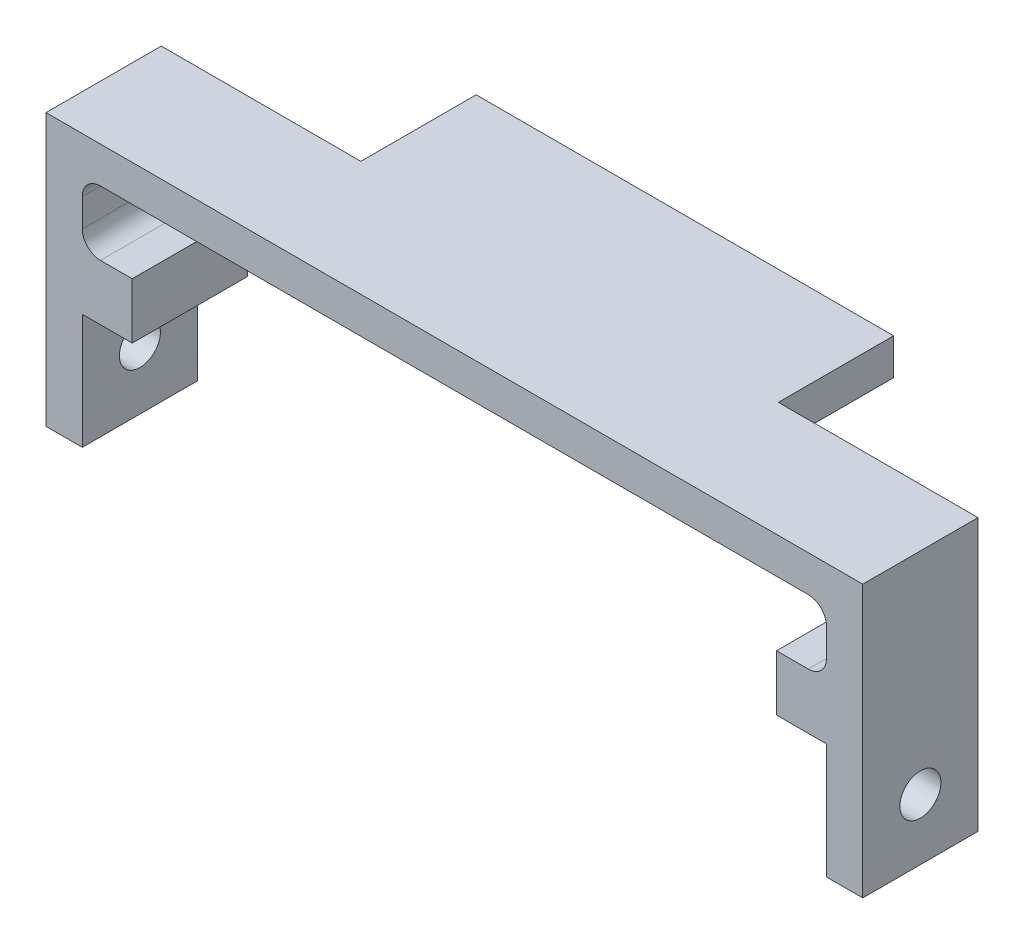
ISO-10303-21;
HEADER;
FILE_DESCRIPTION(('STEP AP214'),'2;1');
FILE_NAME('part.step','',(''),(''),'','','');
FILE_SCHEMA(('AUTOMOTIVE_DESIGN { 1 0 10303 214 1 1 1 1 }'));
ENDSEC;
DATA;
#1=APPLICATION_CONTEXT('core data for automotive mechanical design processes');
#2=APPLICATION_PROTOCOL_DEFINITION('international standard','automotive_design',2000,#1);
#3=PRODUCT_CONTEXT('',#1,'mechanical');
#4=PRODUCT('Part','Part','',(#3));
#5=PRODUCT_RELATED_PRODUCT_CATEGORY('part','',(#4));
#6=PRODUCT_DEFINITION_FORMATION('','',#4);
#7=PRODUCT_DEFINITION_CONTEXT('part definition',#1,'design');
#8=PRODUCT_DEFINITION('design','',#6,#7);
#9=PRODUCT_DEFINITION_SHAPE('','',#8);
#10=(LENGTH_UNIT() NAMED_UNIT(*) SI_UNIT(.MILLI.,.METRE.));
#11=(NAMED_UNIT(*) PLANE_ANGLE_UNIT() SI_UNIT($,.RADIAN.));
#12=(NAMED_UNIT(*) SI_UNIT($,.STERADIAN.) SOLID_ANGLE_UNIT());
#13=UNCERTAINTY_MEASURE_WITH_UNIT(LENGTH_MEASURE(1.E-05),#10,'distance_accuracy_value','');
#14=(GEOMETRIC_REPRESENTATION_CONTEXT(3) GLOBAL_UNCERTAINTY_ASSIGNED_CONTEXT((#13)) GLOBAL_UNIT_ASSIGNED_CONTEXT((#10,
#11,#12)) REPRESENTATION_CONTEXT('',''));
#15=CARTESIAN_POINT('',(0.,0.,0.));
#16=DIRECTION('',(0.,0.,1.));
#17=DIRECTION('',(1.,0.,0.));
#18=AXIS2_PLACEMENT_3D('',#15,#16,#17);
#19=CARTESIAN_POINT('',(0.,0.,0.));
#20=DIRECTION('',(0.,0.,1.));
#21=DIRECTION('',(1.,0.,0.));
#22=AXIS2_PLACEMENT_3D('',#19,#20,#21);
#23=PLANE('',#22);
#24=DIRECTION('',(0.,1.,0.));
#25=VECTOR('',#24,1.);
#26=CARTESIAN_POINT('',(8.,-23.3604798778231,0.));
#27=LINE('',#26,#25);
#28=CARTESIAN_POINT('',(8.,0.499999999999994,0.));
#29=VERTEX_POINT('',#28);
#30=CARTESIAN_POINT('',(8.,2.5,0.));
#31=VERTEX_POINT('',#30);
#32=EDGE_CURVE('E215',#29,#31,#27,.T.);
#33=ORIENTED_EDGE('',*,*,#32,.F.);
#34=DIRECTION('',(1.,0.,0.));
#35=VECTOR('',#34,1.);
#36=CARTESIAN_POINT('',(0.,0.5,0.));
#37=LINE('',#36,#35);
#38=CARTESIAN_POINT('',(0.,0.5,0.));
#39=VERTEX_POINT('',#38);
#40=EDGE_CURVE('E247',#39,#29,#37,.T.);
#41=ORIENTED_EDGE('',*,*,#40,.F.);
#42=CARTESIAN_POINT('',(0.,-0.5,0.));
#43=DIRECTION('',(0.,0.,1.));
#44=DIRECTION('',(1.,0.,0.));
#45=AXIS2_PLACEMENT_3D('',#42,#43,#44);
#46=CIRCLE('',#45,1.);
#47=CARTESIAN_POINT('',(-1.,-0.5,0.));
#48=VERTEX_POINT('',#47);
#49=EDGE_CURVE('E373',#39,#48,#46,.T.);
#50=ORIENTED_EDGE('',*,*,#49,.T.);
#51=DIRECTION('',(0.,1.,0.));
#52=VECTOR('',#51,1.);
#53=CARTESIAN_POINT('',(-1.,0.,0.));
#54=LINE('',#53,#52);
#55=CARTESIAN_POINT('',(-1.,-2.0525,0.));
#56=VERTEX_POINT('',#55);
#57=EDGE_CURVE('E303',#56,#48,#54,.T.);
#58=ORIENTED_EDGE('',*,*,#57,.F.);
#59=CARTESIAN_POINT('',(0.,-2.0525,0.));
#60=DIRECTION('',(0.,0.,1.));
#61=DIRECTION('',(1.,0.,0.));
#62=AXIS2_PLACEMENT_3D('',#59,#60,#61);
#63=CIRCLE('',#62,1.);
#64=CARTESIAN_POINT('',(0.,-3.0525,0.));
#65=VERTEX_POINT('',#64);
#66=EDGE_CURVE('E369',#56,#65,#63,.T.);
#67=ORIENTED_EDGE('',*,*,#66,.T.);
#68=DIRECTION('',(-1.,0.,0.));
#69=VECTOR('',#68,1.);
#70=CARTESIAN_POINT('',(0.,-3.0525,0.));
#71=LINE('',#70,#69);
#72=CARTESIAN_POINT('',(1.75,-3.0525,0.));
#73=VERTEX_POINT('',#72);
#74=EDGE_CURVE('E307',#73,#65,#71,.T.);
#75=ORIENTED_EDGE('',*,*,#74,.F.);
#76=DIRECTION('',(0.,1.,0.));
#77=VECTOR('',#76,1.);
#78=CARTESIAN_POINT('',(1.75,0.,0.));
#79=LINE('',#78,#77);
#80=CARTESIAN_POINT('',(1.75,-6.1225,0.));
#81=VERTEX_POINT('',#80);
#82=EDGE_CURVE('E305',#81,#73,#79,.T.);
#83=ORIENTED_EDGE('',*,*,#82,.F.);
#84=DIRECTION('',(1.,0.,0.));
#85=VECTOR('',#84,1.);
#86=CARTESIAN_POINT('',(0.,-6.1225,0.));
#87=LINE('',#86,#85);
#88=CARTESIAN_POINT('',(-1.,-6.1225,0.));
#89=VERTEX_POINT('',#88);
#90=EDGE_CURVE('E302',#89,#81,#87,.T.);
#91=ORIENTED_EDGE('',*,*,#90,.F.);
#92=CARTESIAN_POINT('',(-1.,-12.4725,0.));
#93=VERTEX_POINT('',#92);
#94=EDGE_CURVE('E300',#93,#89,#54,.T.);
#95=ORIENTED_EDGE('',*,*,#94,.F.);
#96=DIRECTION('',(1.,0.,0.));
#97=VECTOR('',#96,1.);
#98=CARTESIAN_POINT('',(0.,-12.4725,0.));
#99=LINE('',#98,#97);
#100=CARTESIAN_POINT('',(-3.,-12.4725,0.));
#101=VERTEX_POINT('',#100);
#102=EDGE_CURVE('E292',#101,#93,#99,.T.);
#103=ORIENTED_EDGE('',*,*,#102,.F.);
#104=DIRECTION('',(0.,-1.,0.));
#105=VECTOR('',#104,1.);
#106=CARTESIAN_POINT('',(-3.,0.,0.));
#107=LINE('',#106,#105);
#108=CARTESIAN_POINT('',(-3.,2.5,0.));
#109=VERTEX_POINT('',#108);
#110=EDGE_CURVE('E298',#109,#101,#107,.T.);
#111=ORIENTED_EDGE('',*,*,#110,.F.);
#112=DIRECTION('',(1.,0.,0.));
#113=VECTOR('',#112,1.);
#114=CARTESIAN_POINT('',(0.,2.5,0.));
#115=LINE('',#114,#113);
#116=EDGE_CURVE('E296',#109,#31,#115,.T.);
#117=ORIENTED_EDGE('',*,*,#116,.T.);
#118=EDGE_LOOP('',(#33,#41,#50,#58,#67,#75,#83,#91,#95,#103,#111,#117));
#119=FACE_BOUND('',#118,.T.);
#120=ADVANCED_FACE('F45',(#119),#23,.F.);
#121=CARTESIAN_POINT('',(40.,0.,6.35));
#122=DIRECTION('',(1.,0.,0.));
#123=DIRECTION('',(0.,0.,-1.));
#124=AXIS2_PLACEMENT_3D('',#121,#122,#123);
#125=PLANE('',#124);
#126=DIRECTION('',(0.,-1.,0.));
#127=VECTOR('',#126,1.);
#128=CARTESIAN_POINT('',(40.,0.,6.35));
#129=LINE('',#128,#127);
#130=CARTESIAN_POINT('',(40.,-0.5,6.35));
#131=VERTEX_POINT('',#130);
#132=CARTESIAN_POINT('',(40.,-2.0525,6.35));
#133=VERTEX_POINT('',#132);
#134=EDGE_CURVE('E244',#131,#133,#129,.T.);
#135=ORIENTED_EDGE('',*,*,#134,.F.);
#136=DIRECTION('',(0.,0.,-1.));
#137=VECTOR('',#136,1.);
#138=CARTESIAN_POINT('',(40.,-0.5,0.));
#139=LINE('',#138,#137);
#140=CARTESIAN_POINT('',(40.,-0.5,0.));
#141=VERTEX_POINT('',#140);
#142=EDGE_CURVE('E364',#131,#141,#139,.T.);
#143=ORIENTED_EDGE('',*,*,#142,.T.);
#144=DIRECTION('',(0.,-1.,0.));
#145=VECTOR('',#144,1.);
#146=CARTESIAN_POINT('',(40.,0.,0.));
#147=LINE('',#146,#145);
#148=CARTESIAN_POINT('',(40.,-2.0525,0.));
#149=VERTEX_POINT('',#148);
#150=EDGE_CURVE('E243',#141,#149,#147,.T.);
#151=ORIENTED_EDGE('',*,*,#150,.T.);
#152=DIRECTION('',(0.,0.,-1.));
#153=VECTOR('',#152,1.);
#154=CARTESIAN_POINT('',(40.,-2.0525,6.35));
#155=LINE('',#154,#153);
#156=EDGE_CURVE('E362',#149,#133,#155,.F.);
#157=ORIENTED_EDGE('',*,*,#156,.T.);
#158=EDGE_LOOP('',(#135,#143,#151,#157));
#159=FACE_BOUND('',#158,.T.);
#160=ADVANCED_FACE('F388',(#159),#125,.F.);
#161=CARTESIAN_POINT('',(0.,-3.0525,6.35));
#162=DIRECTION('',(0.,-1.,0.));
#163=DIRECTION('',(0.,0.,-1.));
#164=AXIS2_PLACEMENT_3D('',#161,#162,#163);
#165=PLANE('',#164);
#166=DIRECTION('',(-1.,0.,0.));
#167=VECTOR('',#166,1.);
#168=CARTESIAN_POINT('',(0.,-3.0525,6.35));
#169=LINE('',#168,#167);
#170=CARTESIAN_POINT('',(39.,-3.0525,6.35));
#171=VERTEX_POINT('',#170);
#172=CARTESIAN_POINT('',(37.25,-3.0525,6.35));
#173=VERTEX_POINT('',#172);
#174=EDGE_CURVE('E246',#171,#173,#169,.T.);
#175=ORIENTED_EDGE('',*,*,#174,.F.);
#176=DIRECTION('',(0.,0.,-1.));
#177=VECTOR('',#176,1.);
#178=CARTESIAN_POINT('',(39.,-3.0525,0.));
#179=LINE('',#178,#177);
#180=CARTESIAN_POINT('',(39.,-3.0525,0.));
#181=VERTEX_POINT('',#180);
#182=EDGE_CURVE('E367',#171,#181,#179,.T.);
#183=ORIENTED_EDGE('',*,*,#182,.T.);
#184=DIRECTION('',(-1.,0.,0.));
#185=VECTOR('',#184,1.);
#186=CARTESIAN_POINT('',(0.,-3.0525,0.));
#187=LINE('',#186,#185);
#188=CARTESIAN_POINT('',(37.25,-3.0525,0.));
#189=VERTEX_POINT('',#188);
#190=EDGE_CURVE('E281',#181,#189,#187,.T.);
#191=ORIENTED_EDGE('',*,*,#190,.T.);
#192=DIRECTION('',(0.,0.,-1.));
#193=VECTOR('',#192,1.);
#194=CARTESIAN_POINT('',(37.25,-3.0525,6.35));
#195=LINE('',#194,#193);
#196=EDGE_CURVE('E342',#173,#189,#195,.T.);
#197=ORIENTED_EDGE('',*,*,#196,.F.);
#198=EDGE_LOOP('',(#175,#183,#191,#197));
#199=FACE_BOUND('',#198,.T.);
#200=ADVANCED_FACE('F391',(#199),#165,.F.);
#201=CARTESIAN_POINT('',(37.25,0.,6.35));
#202=DIRECTION('',(1.,0.,0.));
#203=DIRECTION('',(0.,0.,-1.));
#204=AXIS2_PLACEMENT_3D('',#201,#202,#203);
#205=PLANE('',#204);
#206=DIRECTION('',(0.,-1.,0.));
#207=VECTOR('',#206,1.);
#208=CARTESIAN_POINT('',(37.25,0.,0.));
#209=LINE('',#208,#207);
#210=CARTESIAN_POINT('',(37.25,-6.1225,0.));
#211=VERTEX_POINT('',#210);
#212=EDGE_CURVE('E284',#189,#211,#209,.T.);
#213=ORIENTED_EDGE('',*,*,#212,.T.);
#214=DIRECTION('',(0.,0.,-1.));
#215=VECTOR('',#214,1.);
#216=CARTESIAN_POINT('',(37.25,-6.1225,6.35));
#217=LINE('',#216,#215);
#218=CARTESIAN_POINT('',(37.25,-6.1225,6.35));
#219=VERTEX_POINT('',#218);
#220=EDGE_CURVE('E339',#219,#211,#217,.T.);
#221=ORIENTED_EDGE('',*,*,#220,.F.);
#222=DIRECTION('',(0.,-1.,0.));
#223=VECTOR('',#222,1.);
#224=CARTESIAN_POINT('',(37.25,0.,6.35));
#225=LINE('',#224,#223);
#226=EDGE_CURVE('E250',#173,#219,#225,.T.);
#227=ORIENTED_EDGE('',*,*,#226,.F.);
#228=ORIENTED_EDGE('',*,*,#196,.T.);
#229=EDGE_LOOP('',(#213,#221,#227,#228));
#230=FACE_BOUND('',#229,.T.);
#231=ADVANCED_FACE('F399',(#230),#205,.F.);
#232=CARTESIAN_POINT('',(0.,-6.1225,6.35));
#233=DIRECTION('',(0.,1.,0.));
#234=DIRECTION('',(0.,0.,1.));
#235=AXIS2_PLACEMENT_3D('',#232,#233,#234);
#236=PLANE('',#235);
#237=DIRECTION('',(1.,0.,0.));
#238=VECTOR('',#237,1.);
#239=CARTESIAN_POINT('',(0.,-6.1225,0.));
#240=LINE('',#239,#238);
#241=CARTESIAN_POINT('',(40.,-6.1225,0.));
#242=VERTEX_POINT('',#241);
#243=EDGE_CURVE('E286',#211,#242,#240,.T.);
#244=ORIENTED_EDGE('',*,*,#243,.T.);
#245=DIRECTION('',(0.,0.,-1.));
#246=VECTOR('',#245,1.);
#247=CARTESIAN_POINT('',(40.,-6.1225,6.35));
#248=LINE('',#247,#246);
#249=CARTESIAN_POINT('',(40.,-6.1225,6.35));
#250=VERTEX_POINT('',#249);
#251=EDGE_CURVE('E336',#250,#242,#248,.T.);
#252=ORIENTED_EDGE('',*,*,#251,.F.);
#253=DIRECTION('',(1.,0.,0.));
#254=VECTOR('',#253,1.);
#255=CARTESIAN_POINT('',(0.,-6.1225,6.35));
#256=LINE('',#255,#254);
#257=EDGE_CURVE('E252',#219,#250,#256,.T.);
#258=ORIENTED_EDGE('',*,*,#257,.F.);
#259=ORIENTED_EDGE('',*,*,#220,.T.);
#260=EDGE_LOOP('',(#244,#252,#258,#259));
#261=FACE_BOUND('',#260,.T.);
#262=ADVANCED_FACE('F402',(#261),#236,.F.);
#263=CARTESIAN_POINT('',(40.,-9.1225,3.175));
#264=DIRECTION('',(1.,0.,0.));
#265=DIRECTION('',(0.,0.,-1.));
#266=AXIS2_PLACEMENT_3D('',#263,#264,#265);
#267=CIRCLE('',#266,1.13029999999999);
#268=CARTESIAN_POINT('',(40.,-9.1225,2.04470000000001));
#269=VERTEX_POINT('',#268);
#270=EDGE_CURVE('E226',#269,#269,#267,.T.);
#271=ORIENTED_EDGE('',*,*,#270,.T.);
#272=EDGE_LOOP('',(#271));
#273=FACE_BOUND('',#272,.T.);
#274=CARTESIAN_POINT('',(40.,-12.4725,0.));
#275=VERTEX_POINT('',#274);
#276=EDGE_CURVE('E282',#242,#275,#147,.T.);
#277=ORIENTED_EDGE('',*,*,#276,.T.);
#278=DIRECTION('',(0.,0.,-1.));
#279=VECTOR('',#278,1.);
#280=CARTESIAN_POINT('',(40.,-12.4725,6.35));
#281=LINE('',#280,#279);
#282=CARTESIAN_POINT('',(40.,-12.4725,6.35));
#283=VERTEX_POINT('',#282);
#284=EDGE_CURVE('E333',#283,#275,#281,.T.);
#285=ORIENTED_EDGE('',*,*,#284,.F.);
#286=EDGE_CURVE('E248',#250,#283,#129,.T.);
#287=ORIENTED_EDGE('',*,*,#286,.F.);
#288=ORIENTED_EDGE('',*,*,#251,.T.);
#289=EDGE_LOOP('',(#277,#285,#287,#288));
#290=FACE_BOUND('',#289,.T.);
#291=ADVANCED_FACE('F407',(#273,#290),#125,.F.);
#292=CARTESIAN_POINT('',(0.,-12.4725,6.35));
#293=DIRECTION('',(0.,1.,0.));
#294=DIRECTION('',(0.,0.,1.));
#295=AXIS2_PLACEMENT_3D('',#292,#293,#294);
#296=PLANE('',#295);
#297=CARTESIAN_POINT('',(42.,-12.4725,0.));
#298=VERTEX_POINT('',#297);
#299=EDGE_CURVE('E288',#275,#298,#99,.T.);
#300=ORIENTED_EDGE('',*,*,#299,.T.);
#301=DIRECTION('',(0.,0.,-1.));
#302=VECTOR('',#301,1.);
#303=CARTESIAN_POINT('',(42.,-12.4725,6.35));
#304=LINE('',#303,#302);
#305=CARTESIAN_POINT('',(42.,-12.4725,6.35));
#306=VERTEX_POINT('',#305);
#307=EDGE_CURVE('E331',#306,#298,#304,.T.);
#308=ORIENTED_EDGE('',*,*,#307,.F.);
#309=DIRECTION('',(1.,0.,0.));
#310=VECTOR('',#309,1.);
#311=CARTESIAN_POINT('',(0.,-12.4725,6.35));
#312=LINE('',#311,#310);
#313=EDGE_CURVE('E254',#283,#306,#312,.T.);
#314=ORIENTED_EDGE('',*,*,#313,.F.);
#315=ORIENTED_EDGE('',*,*,#284,.T.);
#316=EDGE_LOOP('',(#300,#308,#314,#315));
#317=FACE_BOUND('',#316,.T.);
#318=ADVANCED_FACE('F413',(#317),#296,.F.);
#319=CARTESIAN_POINT('',(42.,0.,6.35));
#320=DIRECTION('',(1.,0.,0.));
#321=DIRECTION('',(0.,0.,-1.));
#322=AXIS2_PLACEMENT_3D('',#319,#320,#321);
#323=PLANE('',#322);
#324=CARTESIAN_POINT('',(42.,-9.1225,3.175));
#325=DIRECTION('',(1.,0.,0.));
#326=DIRECTION('',(0.,0.,-1.));
#327=AXIS2_PLACEMENT_3D('',#324,#325,#326);
#328=CIRCLE('',#327,1.13029999999999);
#329=CARTESIAN_POINT('',(42.,-9.1225,2.04470000000001));
#330=VERTEX_POINT('',#329);
#331=EDGE_CURVE('E349',#330,#330,#328,.T.);
#332=ORIENTED_EDGE('',*,*,#331,.F.);
#333=EDGE_LOOP('',(#332));
#334=FACE_BOUND('',#333,.T.);
#335=DIRECTION('',(0.,-1.,0.));
#336=VECTOR('',#335,1.);
#337=CARTESIAN_POINT('',(42.,0.,0.));
#338=LINE('',#337,#336);
#339=CARTESIAN_POINT('',(42.,2.5,0.));
#340=VERTEX_POINT('',#339);
#341=EDGE_CURVE('E291',#340,#298,#338,.T.);
#342=ORIENTED_EDGE('',*,*,#341,.F.);
#343=DIRECTION('',(0.,0.,-1.));
#344=VECTOR('',#343,1.);
#345=CARTESIAN_POINT('',(42.,2.5,6.35));
#346=LINE('',#345,#344);
#347=CARTESIAN_POINT('',(42.,2.5,6.35));
#348=VERTEX_POINT('',#347);
#349=EDGE_CURVE('E328',#348,#340,#346,.T.);
#350=ORIENTED_EDGE('',*,*,#349,.F.);
#351=DIRECTION('',(0.,-1.,0.));
#352=VECTOR('',#351,1.);
#353=CARTESIAN_POINT('',(42.,0.,6.35));
#354=LINE('',#353,#352);
#355=EDGE_CURVE('E256',#348,#306,#354,.T.);
#356=ORIENTED_EDGE('',*,*,#355,.T.);
#357=ORIENTED_EDGE('',*,*,#307,.T.);
#358=EDGE_LOOP('',(#342,#350,#356,#357));
#359=FACE_BOUND('',#358,.T.);
#360=ADVANCED_FACE('F417',(#334,#359),#323,.T.);
#361=CARTESIAN_POINT('',(0.,2.5,6.35));
#362=DIRECTION('',(0.,1.,0.));
#363=DIRECTION('',(0.,0.,1.));
#364=AXIS2_PLACEMENT_3D('',#361,#362,#363);
#365=PLANE('',#364);
#366=ORIENTED_EDGE('',*,*,#116,.F.);
#367=DIRECTION('',(0.,0.,-1.));
#368=VECTOR('',#367,1.);
#369=CARTESIAN_POINT('',(-3.,2.5,6.35));
#370=LINE('',#369,#368);
#371=CARTESIAN_POINT('',(-3.,2.5,6.35));
#372=VERTEX_POINT('',#371);
#373=EDGE_CURVE('E326',#372,#109,#370,.T.);
#374=ORIENTED_EDGE('',*,*,#373,.F.);
#375=DIRECTION('',(1.,0.,0.));
#376=VECTOR('',#375,1.);
#377=CARTESIAN_POINT('',(0.,2.5,6.35));
#378=LINE('',#377,#376);
#379=EDGE_CURVE('E260',#372,#348,#378,.T.);
#380=ORIENTED_EDGE('',*,*,#379,.T.);
#381=ORIENTED_EDGE('',*,*,#349,.T.);
#382=CARTESIAN_POINT('',(31.,2.5,0.));
#383=VERTEX_POINT('',#382);
#384=EDGE_CURVE('E295',#383,#340,#115,.T.);
#385=ORIENTED_EDGE('',*,*,#384,.F.);
#386=DIRECTION('',(0.,0.,1.));
#387=VECTOR('',#386,1.);
#388=CARTESIAN_POINT('',(31.,2.5,0.));
#389=LINE('',#388,#387);
#390=CARTESIAN_POINT('',(31.,2.5,-6.35));
#391=VERTEX_POINT('',#390);
#392=EDGE_CURVE('E216',#391,#383,#389,.T.);
#393=ORIENTED_EDGE('',*,*,#392,.F.);
#394=DIRECTION('',(1.,0.,0.));
#395=VECTOR('',#394,1.);
#396=CARTESIAN_POINT('',(0.,2.5,-6.35));
#397=LINE('',#396,#395);
#398=CARTESIAN_POINT('',(8.,2.5,-6.35));
#399=VERTEX_POINT('',#398);
#400=EDGE_CURVE('E210',#399,#391,#397,.T.);
#401=ORIENTED_EDGE('',*,*,#400,.F.);
#402=DIRECTION('',(0.,0.,1.));
#403=VECTOR('',#402,1.);
#404=CARTESIAN_POINT('',(8.,2.5,0.));
#405=LINE('',#404,#403);
#406=EDGE_CURVE('E223',#399,#31,#405,.T.);
#407=ORIENTED_EDGE('',*,*,#406,.T.);
#408=EDGE_LOOP('',(#366,#374,#380,#381,#385,#393,#401,#407));
#409=FACE_BOUND('',#408,.T.);
#410=ADVANCED_FACE('F222',(#409),#365,.T.);
#411=CARTESIAN_POINT('',(-3.,0.,6.35));
#412=DIRECTION('',(1.,0.,0.));
#413=DIRECTION('',(0.,1.,0.));
#414=AXIS2_PLACEMENT_3D('',#411,#412,#413);
#415=PLANE('',#414);
#416=CARTESIAN_POINT('',(-3.,-9.1225,3.175));
#417=DIRECTION('',(-1.,0.,0.));
#418=DIRECTION('',(0.,0.,1.));
#419=AXIS2_PLACEMENT_3D('',#416,#417,#418);
#420=CIRCLE('',#419,1.13029999999999);
#421=CARTESIAN_POINT('',(-3.,-9.1225,4.30529999999999));
#422=VERTEX_POINT('',#421);
#423=EDGE_CURVE('E350',#422,#422,#420,.T.);
#424=ORIENTED_EDGE('',*,*,#423,.F.);
#425=EDGE_LOOP('',(#424));
#426=FACE_BOUND('',#425,.T.);
#427=ORIENTED_EDGE('',*,*,#110,.T.);
#428=DIRECTION('',(0.,0.,-1.));
#429=VECTOR('',#428,1.);
#430=CARTESIAN_POINT('',(-3.,-12.4725,6.35));
#431=LINE('',#430,#429);
#432=CARTESIAN_POINT('',(-3.,-12.4725,6.35));
#433=VERTEX_POINT('',#432);
#434=EDGE_CURVE('E323',#433,#101,#431,.T.);
#435=ORIENTED_EDGE('',*,*,#434,.F.);
#436=DIRECTION('',(0.,-1.,0.));
#437=VECTOR('',#436,1.);
#438=CARTESIAN_POINT('',(-3.,0.,6.35));
#439=LINE('',#438,#437);
#440=EDGE_CURVE('E263',#372,#433,#439,.T.);
#441=ORIENTED_EDGE('',*,*,#440,.F.);
#442=ORIENTED_EDGE('',*,*,#373,.T.);
#443=EDGE_LOOP('',(#427,#435,#441,#442));
#444=FACE_BOUND('',#443,.T.);
#445=ADVANCED_FACE('F423',(#426,#444),#415,.F.);
#446=ORIENTED_EDGE('',*,*,#102,.T.);
#447=DIRECTION('',(0.,0.,-1.));
#448=VECTOR('',#447,1.);
#449=CARTESIAN_POINT('',(-1.,-12.4725,6.35));
#450=LINE('',#449,#448);
#451=CARTESIAN_POINT('',(-1.,-12.4725,6.35));
#452=VERTEX_POINT('',#451);
#453=EDGE_CURVE('E320',#452,#93,#450,.T.);
#454=ORIENTED_EDGE('',*,*,#453,.F.);
#455=EDGE_CURVE('E257',#433,#452,#312,.T.);
#456=ORIENTED_EDGE('',*,*,#455,.F.);
#457=ORIENTED_EDGE('',*,*,#434,.T.);
#458=EDGE_LOOP('',(#446,#454,#456,#457));
#459=FACE_BOUND('',#458,.T.);
#460=ADVANCED_FACE('F427',(#459),#296,.F.);
#461=CARTESIAN_POINT('',(-1.,0.,6.35));
#462=DIRECTION('',(-1.,0.,0.));
#463=DIRECTION('',(0.,0.,1.));
#464=AXIS2_PLACEMENT_3D('',#461,#462,#463);
#465=PLANE('',#464);
#466=CARTESIAN_POINT('',(-1.,-9.1225,3.175));
#467=DIRECTION('',(-1.,0.,0.));
#468=DIRECTION('',(0.,0.,1.));
#469=AXIS2_PLACEMENT_3D('',#466,#467,#468);
#470=CIRCLE('',#469,1.13029999999999);
#471=CARTESIAN_POINT('',(-1.,-9.1225,4.30529999999999));
#472=VERTEX_POINT('',#471);
#473=EDGE_CURVE('E346',#472,#472,#470,.T.);
#474=ORIENTED_EDGE('',*,*,#473,.T.);
#475=EDGE_LOOP('',(#474));
#476=FACE_BOUND('',#475,.T.);
#477=ORIENTED_EDGE('',*,*,#94,.T.);
#478=DIRECTION('',(0.,0.,-1.));
#479=VECTOR('',#478,1.);
#480=CARTESIAN_POINT('',(-1.,-6.1225,6.35));
#481=LINE('',#480,#479);
#482=CARTESIAN_POINT('',(-1.,-6.1225,6.35));
#483=VERTEX_POINT('',#482);
#484=EDGE_CURVE('E317',#483,#89,#481,.T.);
#485=ORIENTED_EDGE('',*,*,#484,.F.);
#486=DIRECTION('',(0.,1.,0.));
#487=VECTOR('',#486,1.);
#488=CARTESIAN_POINT('',(-1.,0.,6.35));
#489=LINE('',#488,#487);
#490=EDGE_CURVE('E265',#452,#483,#489,.T.);
#491=ORIENTED_EDGE('',*,*,#490,.F.);
#492=ORIENTED_EDGE('',*,*,#453,.T.);
#493=EDGE_LOOP('',(#477,#485,#491,#492));
#494=FACE_BOUND('',#493,.T.);
#495=ADVANCED_FACE('F432',(#476,#494),#465,.F.);
#496=CARTESIAN_POINT('',(0.,-6.1225,6.35));
#497=DIRECTION('',(0.,1.,0.));
#498=DIRECTION('',(0.,0.,1.));
#499=AXIS2_PLACEMENT_3D('',#496,#497,#498);
#500=PLANE('',#499);
#501=ORIENTED_EDGE('',*,*,#90,.T.);
#502=DIRECTION('',(0.,0.,-1.));
#503=VECTOR('',#502,1.);
#504=CARTESIAN_POINT('',(1.75,-6.1225,6.35));
#505=LINE('',#504,#503);
#506=CARTESIAN_POINT('',(1.75,-6.1225,6.35));
#507=VERTEX_POINT('',#506);
#508=EDGE_CURVE('E314',#507,#81,#505,.T.);
#509=ORIENTED_EDGE('',*,*,#508,.F.);
#510=DIRECTION('',(1.,0.,0.));
#511=VECTOR('',#510,1.);
#512=CARTESIAN_POINT('',(0.,-6.1225,6.35));
#513=LINE('',#512,#511);
#514=EDGE_CURVE('E267',#483,#507,#513,.T.);
#515=ORIENTED_EDGE('',*,*,#514,.F.);
#516=ORIENTED_EDGE('',*,*,#484,.T.);
#517=EDGE_LOOP('',(#501,#509,#515,#516));
#518=FACE_BOUND('',#517,.T.);
#519=ADVANCED_FACE('F438',(#518),#500,.F.);
#520=CARTESIAN_POINT('',(1.75,0.,6.35));
#521=DIRECTION('',(-1.,0.,0.));
#522=DIRECTION('',(0.,0.,1.));
#523=AXIS2_PLACEMENT_3D('',#520,#521,#522);
#524=PLANE('',#523);
#525=ORIENTED_EDGE('',*,*,#82,.T.);
#526=DIRECTION('',(0.,0.,-1.));
#527=VECTOR('',#526,1.);
#528=CARTESIAN_POINT('',(1.75,-3.0525,6.35));
#529=LINE('',#528,#527);
#530=CARTESIAN_POINT('',(1.75,-3.0525,6.35));
#531=VERTEX_POINT('',#530);
#532=EDGE_CURVE('E278',#531,#73,#529,.T.);
#533=ORIENTED_EDGE('',*,*,#532,.F.);
#534=DIRECTION('',(0.,1.,0.));
#535=VECTOR('',#534,1.);
#536=CARTESIAN_POINT('',(1.75,0.,6.35));
#537=LINE('',#536,#535);
#538=EDGE_CURVE('E270',#507,#531,#537,.T.);
#539=ORIENTED_EDGE('',*,*,#538,.F.);
#540=ORIENTED_EDGE('',*,*,#508,.T.);
#541=EDGE_LOOP('',(#525,#533,#539,#540));
#542=FACE_BOUND('',#541,.T.);
#543=ADVANCED_FACE('F442',(#542),#524,.F.);
#544=CARTESIAN_POINT('',(0.,-3.0525,6.35));
#545=DIRECTION('',(0.,-1.,0.));
#546=DIRECTION('',(0.,0.,-1.));
#547=AXIS2_PLACEMENT_3D('',#544,#545,#546);
#548=PLANE('',#547);
#549=ORIENTED_EDGE('',*,*,#74,.T.);
#550=DIRECTION('',(0.,0.,-1.));
#551=VECTOR('',#550,1.);
#552=CARTESIAN_POINT('',(0.,-3.0525,6.35));
#553=LINE('',#552,#551);
#554=CARTESIAN_POINT('',(0.,-3.0525,6.35));
#555=VERTEX_POINT('',#554);
#556=EDGE_CURVE('E355',#65,#555,#553,.F.);
#557=ORIENTED_EDGE('',*,*,#556,.T.);
#558=DIRECTION('',(-1.,0.,0.));
#559=VECTOR('',#558,1.);
#560=CARTESIAN_POINT('',(0.,-3.0525,6.35));
#561=LINE('',#560,#559);
#562=EDGE_CURVE('E272',#531,#555,#561,.T.);
#563=ORIENTED_EDGE('',*,*,#562,.F.);
#564=ORIENTED_EDGE('',*,*,#532,.T.);
#565=EDGE_LOOP('',(#549,#557,#563,#564));
#566=FACE_BOUND('',#565,.T.);
#567=ADVANCED_FACE('F446',(#566),#548,.F.);
#568=CARTESIAN_POINT('',(-1.,-2.0525,6.35));
#569=VERTEX_POINT('',#568);
#570=CARTESIAN_POINT('',(-1.,-0.5,6.35));
#571=VERTEX_POINT('',#570);
#572=EDGE_CURVE('E268',#569,#571,#489,.T.);
#573=ORIENTED_EDGE('',*,*,#572,.F.);
#574=DIRECTION('',(0.,0.,-1.));
#575=VECTOR('',#574,1.);
#576=CARTESIAN_POINT('',(-1.,-2.0525,0.));
#577=LINE('',#576,#575);
#578=EDGE_CURVE('E352',#569,#56,#577,.T.);
#579=ORIENTED_EDGE('',*,*,#578,.T.);
#580=ORIENTED_EDGE('',*,*,#57,.T.);
#581=DIRECTION('',(0.,0.,-1.));
#582=VECTOR('',#581,1.);
#583=CARTESIAN_POINT('',(-1.,-0.5,6.35));
#584=LINE('',#583,#582);
#585=EDGE_CURVE('E345',#48,#571,#584,.F.);
#586=ORIENTED_EDGE('',*,*,#585,.T.);
#587=EDGE_LOOP('',(#573,#579,#580,#586));
#588=FACE_BOUND('',#587,.T.);
#589=ADVANCED_FACE('F457',(#588),#465,.F.);
#590=CARTESIAN_POINT('',(0.,0.5,6.35));
#591=DIRECTION('',(0.,1.,0.));
#592=DIRECTION('',(0.,0.,1.));
#593=AXIS2_PLACEMENT_3D('',#590,#591,#592);
#594=PLANE('',#593);
#595=DIRECTION('',(1.,0.,0.));
#596=VECTOR('',#595,1.);
#597=CARTESIAN_POINT('',(0.,0.5,6.35));
#598=LINE('',#597,#596);
#599=CARTESIAN_POINT('',(0.,0.5,6.35));
#600=VERTEX_POINT('',#599);
#601=CARTESIAN_POINT('',(39.,0.5,6.35));
#602=VERTEX_POINT('',#601);
#603=EDGE_CURVE('E275',#600,#602,#598,.T.);
#604=ORIENTED_EDGE('',*,*,#603,.F.);
#605=DIRECTION('',(0.,0.,-1.));
#606=VECTOR('',#605,1.);
#607=CARTESIAN_POINT('',(0.,0.5,0.));
#608=LINE('',#607,#606);
#609=EDGE_CURVE('E359',#600,#39,#608,.T.);
#610=ORIENTED_EDGE('',*,*,#609,.T.);
#611=ORIENTED_EDGE('',*,*,#40,.T.);
#612=DIRECTION('',(0.,0.,-1.));
#613=VECTOR('',#612,1.);
#614=CARTESIAN_POINT('',(8.,0.5,0.));
#615=LINE('',#614,#613);
#616=CARTESIAN_POINT('',(8.,0.5,-6.35));
#617=VERTEX_POINT('',#616);
#618=EDGE_CURVE('E241',#29,#617,#615,.T.);
#619=ORIENTED_EDGE('',*,*,#618,.T.);
#620=DIRECTION('',(-1.,0.,0.));
#621=VECTOR('',#620,1.);
#622=CARTESIAN_POINT('',(0.,0.5,-6.35));
#623=LINE('',#622,#621);
#624=CARTESIAN_POINT('',(31.,0.5,-6.35));
#625=VERTEX_POINT('',#624);
#626=EDGE_CURVE('E211',#625,#617,#623,.T.);
#627=ORIENTED_EDGE('',*,*,#626,.F.);
#628=DIRECTION('',(0.,0.,-1.));
#629=VECTOR('',#628,1.);
#630=CARTESIAN_POINT('',(31.,0.5,0.));
#631=LINE('',#630,#629);
#632=CARTESIAN_POINT('',(31.,0.5,0.));
#633=VERTEX_POINT('',#632);
#634=EDGE_CURVE('E236',#633,#625,#631,.T.);
#635=ORIENTED_EDGE('',*,*,#634,.F.);
#636=CARTESIAN_POINT('',(39.,0.5,0.));
#637=VERTEX_POINT('',#636);
#638=EDGE_CURVE('E311',#633,#637,#37,.T.);
#639=ORIENTED_EDGE('',*,*,#638,.T.);
#640=DIRECTION('',(0.,0.,-1.));
#641=VECTOR('',#640,1.);
#642=CARTESIAN_POINT('',(39.,0.5,6.35));
#643=LINE('',#642,#641);
#644=EDGE_CURVE('E357',#637,#602,#643,.F.);
#645=ORIENTED_EDGE('',*,*,#644,.T.);
#646=EDGE_LOOP('',(#604,#610,#611,#619,#627,#635,#639,#645));
#647=FACE_BOUND('',#646,.T.);
#648=ADVANCED_FACE('F465',(#647),#594,.F.);
#649=CARTESIAN_POINT('',(0.,0.,6.35));
#650=DIRECTION('',(0.,0.,1.));
#651=DIRECTION('',(1.,0.,0.));
#652=AXIS2_PLACEMENT_3D('',#649,#650,#651);
#653=PLANE('',#652);
#654=ORIENTED_EDGE('',*,*,#603,.T.);
#655=CARTESIAN_POINT('',(39.,-0.5,6.35));
#656=DIRECTION('',(0.,0.,1.));
#657=DIRECTION('',(1.,0.,0.));
#658=AXIS2_PLACEMENT_3D('',#655,#656,#657);
#659=CIRCLE('',#658,1.);
#660=EDGE_CURVE('E379',#602,#131,#659,.F.);
#661=ORIENTED_EDGE('',*,*,#660,.T.);
#662=ORIENTED_EDGE('',*,*,#134,.T.);
#663=CARTESIAN_POINT('',(39.,-2.0525,6.35));
#664=DIRECTION('',(0.,0.,1.));
#665=DIRECTION('',(1.,0.,0.));
#666=AXIS2_PLACEMENT_3D('',#663,#664,#665);
#667=CIRCLE('',#666,1.);
#668=EDGE_CURVE('E11',#133,#171,#667,.F.);
#669=ORIENTED_EDGE('',*,*,#668,.T.);
#670=ORIENTED_EDGE('',*,*,#174,.T.);
#671=ORIENTED_EDGE('',*,*,#226,.T.);
#672=ORIENTED_EDGE('',*,*,#257,.T.);
#673=ORIENTED_EDGE('',*,*,#286,.T.);
#674=ORIENTED_EDGE('',*,*,#313,.T.);
#675=ORIENTED_EDGE('',*,*,#355,.F.);
#676=ORIENTED_EDGE('',*,*,#379,.F.);
#677=ORIENTED_EDGE('',*,*,#440,.T.);
#678=ORIENTED_EDGE('',*,*,#455,.T.);
#679=ORIENTED_EDGE('',*,*,#490,.T.);
#680=ORIENTED_EDGE('',*,*,#514,.T.);
#681=ORIENTED_EDGE('',*,*,#538,.T.);
#682=ORIENTED_EDGE('',*,*,#562,.T.);
#683=CARTESIAN_POINT('',(0.,-2.0525,6.35));
#684=DIRECTION('',(0.,0.,1.));
#685=DIRECTION('',(1.,0.,0.));
#686=AXIS2_PLACEMENT_3D('',#683,#684,#685);
#687=CIRCLE('',#686,1.);
#688=EDGE_CURVE('E371',#555,#569,#687,.F.);
#689=ORIENTED_EDGE('',*,*,#688,.T.);
#690=ORIENTED_EDGE('',*,*,#572,.T.);
#691=CARTESIAN_POINT('',(0.,-0.5,6.35));
#692=DIRECTION('',(0.,0.,1.));
#693=DIRECTION('',(1.,0.,0.));
#694=AXIS2_PLACEMENT_3D('',#691,#692,#693);
#695=CIRCLE('',#694,1.);
#696=EDGE_CURVE('E375',#571,#600,#695,.F.);
#697=ORIENTED_EDGE('',*,*,#696,.T.);
#698=EDGE_LOOP('',(#654,#661,#662,#669,#670,#671,#672,#673,#674,#675,#676,#677,#678,#679,#680,
#681,#682,#689,#690,#697));
#699=FACE_BOUND('',#698,.T.);
#700=ADVANCED_FACE('F394',(#699),#653,.T.);
#701=ORIENTED_EDGE('',*,*,#638,.F.);
#702=DIRECTION('',(0.,1.,0.));
#703=VECTOR('',#702,1.);
#704=CARTESIAN_POINT('',(31.,-23.3604798778231,0.));
#705=LINE('',#704,#703);
#706=EDGE_CURVE('E237',#633,#383,#705,.T.);
#707=ORIENTED_EDGE('',*,*,#706,.T.);
#708=ORIENTED_EDGE('',*,*,#384,.T.);
#709=ORIENTED_EDGE('',*,*,#341,.T.);
#710=ORIENTED_EDGE('',*,*,#299,.F.);
#711=ORIENTED_EDGE('',*,*,#276,.F.);
#712=ORIENTED_EDGE('',*,*,#243,.F.);
#713=ORIENTED_EDGE('',*,*,#212,.F.);
#714=ORIENTED_EDGE('',*,*,#190,.F.);
#715=CARTESIAN_POINT('',(39.,-2.0525,0.));
#716=DIRECTION('',(0.,0.,1.));
#717=DIRECTION('',(1.,0.,0.));
#718=AXIS2_PLACEMENT_3D('',#715,#716,#717);
#719=CIRCLE('',#718,1.);
#720=EDGE_CURVE('E53',#181,#149,#719,.T.);
#721=ORIENTED_EDGE('',*,*,#720,.T.);
#722=ORIENTED_EDGE('',*,*,#150,.F.);
#723=CARTESIAN_POINT('',(39.,-0.5,0.));
#724=DIRECTION('',(0.,0.,1.));
#725=DIRECTION('',(1.,0.,0.));
#726=AXIS2_PLACEMENT_3D('',#723,#724,#725);
#727=CIRCLE('',#726,1.);
#728=EDGE_CURVE('E377',#141,#637,#727,.T.);
#729=ORIENTED_EDGE('',*,*,#728,.T.);
#730=EDGE_LOOP('',(#701,#707,#708,#709,#710,#711,#712,#713,#714,#721,#722,#729));
#731=FACE_BOUND('',#730,.T.);
#732=ADVANCED_FACE('F384',(#731),#23,.F.);
#733=CARTESIAN_POINT('',(0.,-23.3604798778231,-6.35));
#734=DIRECTION('',(0.,0.,1.));
#735=DIRECTION('',(1.,0.,0.));
#736=AXIS2_PLACEMENT_3D('',#733,#734,#735);
#737=PLANE('',#736);
#738=DIRECTION('',(0.,1.,0.));
#739=VECTOR('',#738,1.);
#740=CARTESIAN_POINT('',(31.,-23.3604798778231,-6.35));
#741=LINE('',#740,#739);
#742=EDGE_CURVE('E234',#625,#391,#741,.T.);
#743=ORIENTED_EDGE('',*,*,#742,.F.);
#744=ORIENTED_EDGE('',*,*,#626,.T.);
#745=DIRECTION('',(0.,1.,0.));
#746=VECTOR('',#745,1.);
#747=CARTESIAN_POINT('',(8.,-23.3604798778231,-6.35));
#748=LINE('',#747,#746);
#749=EDGE_CURVE('E206',#617,#399,#748,.T.);
#750=ORIENTED_EDGE('',*,*,#749,.T.);
#751=ORIENTED_EDGE('',*,*,#400,.T.);
#752=EDGE_LOOP('',(#743,#744,#750,#751));
#753=FACE_BOUND('',#752,.T.);
#754=ADVANCED_FACE('F209',(#753),#737,.F.);
#755=CARTESIAN_POINT('',(31.,-23.3604798778231,0.));
#756=DIRECTION('',(-1.,0.,0.));
#757=DIRECTION('',(0.,0.,1.));
#758=AXIS2_PLACEMENT_3D('',#755,#756,#757);
#759=PLANE('',#758);
#760=ORIENTED_EDGE('',*,*,#706,.F.);
#761=ORIENTED_EDGE('',*,*,#634,.T.);
#762=ORIENTED_EDGE('',*,*,#742,.T.);
#763=ORIENTED_EDGE('',*,*,#392,.T.);
#764=EDGE_LOOP('',(#760,#761,#762,#763));
#765=FACE_BOUND('',#764,.T.);
#766=ADVANCED_FACE('F496',(#765),#759,.F.);
#767=CARTESIAN_POINT('',(8.,-23.3604798778231,0.));
#768=DIRECTION('',(-1.,0.,0.));
#769=DIRECTION('',(0.,0.,1.));
#770=AXIS2_PLACEMENT_3D('',#767,#768,#769);
#771=PLANE('',#770);
#772=ORIENTED_EDGE('',*,*,#618,.F.);
#773=ORIENTED_EDGE('',*,*,#32,.T.);
#774=ORIENTED_EDGE('',*,*,#406,.F.);
#775=ORIENTED_EDGE('',*,*,#749,.F.);
#776=EDGE_LOOP('',(#772,#773,#774,#775));
#777=FACE_BOUND('',#776,.T.);
#778=ADVANCED_FACE('F228',(#777),#771,.T.);
#779=CARTESIAN_POINT('',(42.,-9.1225,3.175));
#780=DIRECTION('',(1.,0.,0.));
#781=DIRECTION('',(0.,0.,-1.));
#782=AXIS2_PLACEMENT_3D('',#779,#780,#781);
#783=CYLINDRICAL_SURFACE('',#782,1.13029999999999);
#784=ORIENTED_EDGE('',*,*,#331,.T.);
#785=EDGE_LOOP('',(#784));
#786=FACE_BOUND('',#785,.T.);
#787=ORIENTED_EDGE('',*,*,#270,.F.);
#788=EDGE_LOOP('',(#787));
#789=FACE_BOUND('',#788,.T.);
#790=ADVANCED_FACE('F504',(#786,#789),#783,.F.);
#791=CARTESIAN_POINT('',(-3.,-9.1225,3.175));
#792=DIRECTION('',(-1.,0.,0.));
#793=DIRECTION('',(0.,0.,1.));
#794=AXIS2_PLACEMENT_3D('',#791,#792,#793);
#795=CYLINDRICAL_SURFACE('',#794,1.13029999999999);
#796=ORIENTED_EDGE('',*,*,#423,.T.);
#797=EDGE_LOOP('',(#796));
#798=FACE_BOUND('',#797,.T.);
#799=ORIENTED_EDGE('',*,*,#473,.F.);
#800=EDGE_LOOP('',(#799));
#801=FACE_BOUND('',#800,.T.);
#802=ADVANCED_FACE('F481',(#798,#801),#795,.F.);
#803=CARTESIAN_POINT('',(0.,-2.0525,6.35));
#804=DIRECTION('',(0.,0.,1.));
#805=DIRECTION('',(1.,0.,0.));
#806=AXIS2_PLACEMENT_3D('',#803,#804,#805);
#807=CYLINDRICAL_SURFACE('',#806,1.);
#808=ORIENTED_EDGE('',*,*,#688,.F.);
#809=ORIENTED_EDGE('',*,*,#556,.F.);
#810=ORIENTED_EDGE('',*,*,#66,.F.);
#811=ORIENTED_EDGE('',*,*,#578,.F.);
#812=EDGE_LOOP('',(#808,#809,#810,#811));
#813=FACE_BOUND('',#812,.T.);
#814=ADVANCED_FACE('F453',(#813),#807,.F.);
#815=CARTESIAN_POINT('',(0.,-0.5,6.35));
#816=DIRECTION('',(0.,0.,1.));
#817=DIRECTION('',(1.,0.,0.));
#818=AXIS2_PLACEMENT_3D('',#815,#816,#817);
#819=CYLINDRICAL_SURFACE('',#818,1.);
#820=ORIENTED_EDGE('',*,*,#696,.F.);
#821=ORIENTED_EDGE('',*,*,#585,.F.);
#822=ORIENTED_EDGE('',*,*,#49,.F.);
#823=ORIENTED_EDGE('',*,*,#609,.F.);
#824=EDGE_LOOP('',(#820,#821,#822,#823));
#825=FACE_BOUND('',#824,.T.);
#826=ADVANCED_FACE('F474',(#825),#819,.F.);
#827=CARTESIAN_POINT('',(39.,-0.5,6.35));
#828=DIRECTION('',(0.,0.,1.));
#829=DIRECTION('',(1.,0.,0.));
#830=AXIS2_PLACEMENT_3D('',#827,#828,#829);
#831=CYLINDRICAL_SURFACE('',#830,1.);
#832=ORIENTED_EDGE('',*,*,#660,.F.);
#833=ORIENTED_EDGE('',*,*,#644,.F.);
#834=ORIENTED_EDGE('',*,*,#728,.F.);
#835=ORIENTED_EDGE('',*,*,#142,.F.);
#836=EDGE_LOOP('',(#832,#833,#834,#835));
#837=FACE_BOUND('',#836,.T.);
#838=ADVANCED_FACE('F470',(#837),#831,.F.);
#839=CARTESIAN_POINT('',(39.,-2.0525,6.35));
#840=DIRECTION('',(0.,0.,1.));
#841=DIRECTION('',(1.,0.,0.));
#842=AXIS2_PLACEMENT_3D('',#839,#840,#841);
#843=CYLINDRICAL_SURFACE('',#842,1.);
#844=ORIENTED_EDGE('',*,*,#668,.F.);
#845=ORIENTED_EDGE('',*,*,#156,.F.);
#846=ORIENTED_EDGE('',*,*,#720,.F.);
#847=ORIENTED_EDGE('',*,*,#182,.F.);
#848=EDGE_LOOP('',(#844,#845,#846,#847));
#849=FACE_BOUND('',#848,.T.);
#850=ADVANCED_FACE('F47',(#849),#843,.F.);
#851=CLOSED_SHELL('',(#120,#160,#200,#231,#262,#291,#318,#360,#410,#445,#460,#495,#519,#543,
#567,#589,#648,#700,#732,#754,#766,#778,#790,#802,#814,#826,#838,#850));
#852=MANIFOLD_SOLID_BREP('B2',#851);
#853=ADVANCED_BREP_SHAPE_REPRESENTATION('',(#18,#852),#14);
#854=SHAPE_DEFINITION_REPRESENTATION(#9,#853);
ENDSEC;
END-ISO-10303-21;
